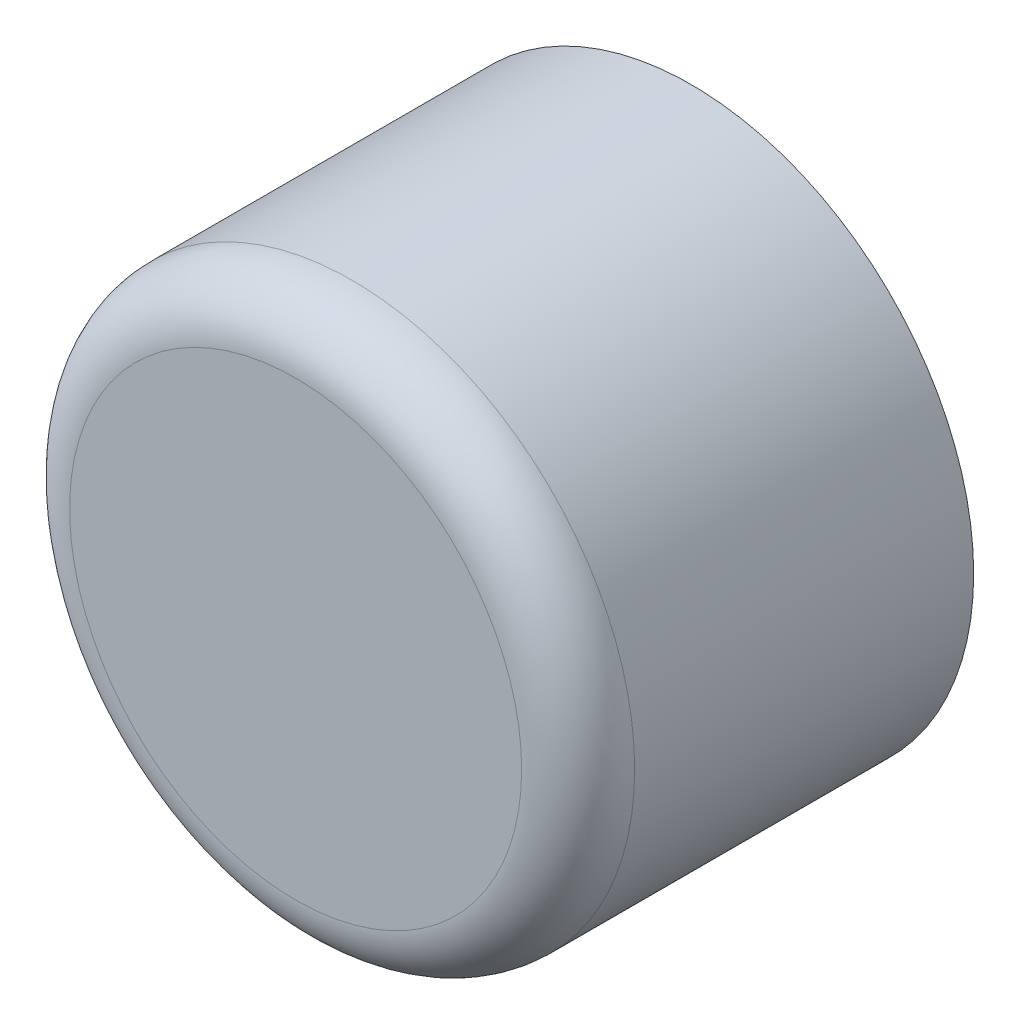
ISO-10303-21;
HEADER;
FILE_DESCRIPTION(('STEP AP214'),'2;1');
FILE_NAME('part.step','',(''),(''),'','','');
FILE_SCHEMA(('AUTOMOTIVE_DESIGN { 1 0 10303 214 1 1 1 1 }'));
ENDSEC;
DATA;
#1=APPLICATION_CONTEXT('core data for automotive mechanical design processes');
#2=APPLICATION_PROTOCOL_DEFINITION('international standard','automotive_design',2000,#1);
#3=PRODUCT_CONTEXT('',#1,'mechanical');
#4=PRODUCT('Part','Part','',(#3));
#5=PRODUCT_RELATED_PRODUCT_CATEGORY('part','',(#4));
#6=PRODUCT_DEFINITION_FORMATION('','',#4);
#7=PRODUCT_DEFINITION_CONTEXT('part definition',#1,'design');
#8=PRODUCT_DEFINITION('design','',#6,#7);
#9=PRODUCT_DEFINITION_SHAPE('','',#8);
#10=(LENGTH_UNIT() NAMED_UNIT(*) SI_UNIT(.MILLI.,.METRE.));
#11=(NAMED_UNIT(*) PLANE_ANGLE_UNIT() SI_UNIT($,.RADIAN.));
#12=(NAMED_UNIT(*) SI_UNIT($,.STERADIAN.) SOLID_ANGLE_UNIT());
#13=UNCERTAINTY_MEASURE_WITH_UNIT(LENGTH_MEASURE(1.E-05),#10,'distance_accuracy_value','');
#14=(GEOMETRIC_REPRESENTATION_CONTEXT(3) GLOBAL_UNCERTAINTY_ASSIGNED_CONTEXT((#13)) GLOBAL_UNIT_ASSIGNED_CONTEXT((#10,
#11,#12)) REPRESENTATION_CONTEXT('',''));
#15=CARTESIAN_POINT('',(0.,0.,0.));
#16=DIRECTION('',(0.,0.,1.));
#17=DIRECTION('',(1.,0.,0.));
#18=AXIS2_PLACEMENT_3D('',#15,#16,#17);
#19=CARTESIAN_POINT('',(30.4183841102695,-58.0983755696771,7.97179999999999));
#20=DIRECTION('',(0.,0.,-1.));
#21=DIRECTION('',(-1.,0.,0.));
#22=AXIS2_PLACEMENT_3D('',#19,#20,#21);
#23=CYLINDRICAL_SURFACE('',#22,5.);
#24=CARTESIAN_POINT('',(30.4183841102695,-58.0983755696771,6.97179999999999));
#25=DIRECTION('',(0.,0.,1.));
#26=DIRECTION('',(1.,0.,0.));
#27=AXIS2_PLACEMENT_3D('',#24,#25,#26);
#28=CIRCLE('',#27,5.);
#29=CARTESIAN_POINT('',(35.4183841102695,-58.0983755696771,6.97179999999999));
#30=VERTEX_POINT('',#29);
#31=EDGE_CURVE('E11',#30,#30,#28,.F.);
#32=ORIENTED_EDGE('',*,*,#31,.T.);
#33=EDGE_LOOP('',(#32));
#34=FACE_BOUND('',#33,.T.);
#35=CARTESIAN_POINT('',(30.4183841102695,-58.0983755696771,0.971799999999992));
#36=DIRECTION('',(0.,0.,-1.));
#37=DIRECTION('',(-1.,0.,0.));
#38=AXIS2_PLACEMENT_3D('',#35,#36,#37);
#39=CIRCLE('',#38,5.);
#40=CARTESIAN_POINT('',(25.4183841102695,-58.0983755696771,0.971799999999992));
#41=VERTEX_POINT('',#40);
#42=EDGE_CURVE('E111',#41,#41,#39,.T.);
#43=ORIENTED_EDGE('',*,*,#42,.F.);
#44=EDGE_LOOP('',(#43));
#45=FACE_BOUND('',#44,.T.);
#46=ADVANCED_FACE('F33',(#34,#45),#23,.T.);
#47=CARTESIAN_POINT('',(30.4183841102695,-58.0983755696771,7.97179999999999));
#48=DIRECTION('',(0.,0.,1.));
#49=DIRECTION('',(1.,0.,0.));
#50=AXIS2_PLACEMENT_3D('',#47,#48,#49);
#51=PLANE('',#50);
#52=CARTESIAN_POINT('',(30.4183841102695,-58.0983755696771,7.97179999999999));
#53=DIRECTION('',(0.,0.,1.));
#54=DIRECTION('',(1.,0.,0.));
#55=AXIS2_PLACEMENT_3D('',#52,#53,#54);
#56=CIRCLE('',#55,4.);
#57=CARTESIAN_POINT('',(34.4183841102695,-58.0983755696771,7.97179999999999));
#58=VERTEX_POINT('',#57);
#59=EDGE_CURVE('E41',#58,#58,#56,.T.);
#60=ORIENTED_EDGE('',*,*,#59,.T.);
#61=EDGE_LOOP('',(#60));
#62=FACE_BOUND('',#61,.T.);
#63=ADVANCED_FACE('F116',(#62),#51,.T.);
#64=CARTESIAN_POINT('',(30.4183841102695,-58.0983755696771,0.971799999999992));
#65=DIRECTION('',(0.,0.,-1.));
#66=DIRECTION('',(-1.,0.,0.));
#67=AXIS2_PLACEMENT_3D('',#64,#65,#66);
#68=PLANE('',#67);
#69=DIRECTION('',(-0.729860722083863,0.683595879419428,0.));
#70=VECTOR('',#69,1.);
#71=CARTESIAN_POINT('',(30.1635455688319,-61.1200389589047,0.971799999999992));
#72=LINE('',#71,#70);
#73=CARTESIAN_POINT('',(30.5284759298738,-61.4618368986144,0.971799999999992));
#74=VERTEX_POINT('',#73);
#75=CARTESIAN_POINT('',(27.0549227813323,-58.2084673892815,0.971799999999992));
#76=VERTEX_POINT('',#75);
#77=EDGE_CURVE('E56',#74,#76,#72,.T.);
#78=ORIENTED_EDGE('',*,*,#77,.F.);
#79=DIRECTION('',(-0.683595879419425,-0.729860722083866,0.));
#80=VECTOR('',#79,1.);
#81=CARTESIAN_POINT('',(33.7818454392067,-57.9882837500729,0.971799999999992));
#82=LINE('',#81,#80);
#83=CARTESIAN_POINT('',(33.7818454392067,-57.9882837500729,0.971799999999992));
#84=VERTEX_POINT('',#83);
#85=EDGE_CURVE('E95',#84,#74,#82,.T.);
#86=ORIENTED_EDGE('',*,*,#85,.F.);
#87=DIRECTION('',(0.729860722083864,-0.683595879419427,0.));
#88=VECTOR('',#87,1.);
#89=CARTESIAN_POINT('',(30.6732226517071,-55.0767121804496,0.971799999999992));
#90=LINE('',#89,#88);
#91=CARTESIAN_POINT('',(30.3082922906652,-54.7349142407399,0.971799999999992));
#92=VERTEX_POINT('',#91);
#93=EDGE_CURVE('E48',#92,#84,#90,.T.);
#94=ORIENTED_EDGE('',*,*,#93,.F.);
#95=DIRECTION('',(0.683595879419427,0.729860722083865,0.));
#96=VECTOR('',#95,1.);
#97=CARTESIAN_POINT('',(27.0549227813323,-58.2084673892815,0.971799999999992));
#98=LINE('',#97,#96);
#99=EDGE_CURVE('E83',#76,#92,#98,.T.);
#100=ORIENTED_EDGE('',*,*,#99,.F.);
#101=EDGE_LOOP('',(#78,#86,#94,#100));
#102=FACE_BOUND('',#101,.T.);
#103=ORIENTED_EDGE('',*,*,#42,.T.);
#104=EDGE_LOOP('',(#103));
#105=FACE_BOUND('',#104,.T.);
#106=ADVANCED_FACE('F132',(#102,#105),#68,.T.);
#107=CARTESIAN_POINT('',(30.4183841102695,-58.0983755696771,2.97179999999999));
#108=DIRECTION('',(0.,0.,1.));
#109=DIRECTION('',(1.,0.,0.));
#110=AXIS2_PLACEMENT_3D('',#107,#108,#109);
#111=PLANE('',#110);
#112=DIRECTION('',(-0.729860722083864,0.683595879419427,0.));
#113=VECTOR('',#112,1.);
#114=CARTESIAN_POINT('',(33.4169150781648,-57.6464858103631,2.97179999999999));
#115=LINE('',#114,#113);
#116=CARTESIAN_POINT('',(33.7818454392067,-57.9882837500729,2.97179999999999));
#117=VERTEX_POINT('',#116);
#118=CARTESIAN_POINT('',(30.3082922906652,-54.7349142407399,2.97179999999999));
#119=VERTEX_POINT('',#118);
#120=EDGE_CURVE('E88',#117,#119,#115,.T.);
#121=ORIENTED_EDGE('',*,*,#120,.F.);
#122=DIRECTION('',(0.683595879419425,0.729860722083866,0.));
#123=VECTOR('',#122,1.);
#124=CARTESIAN_POINT('',(30.5284759298738,-61.4618368986144,2.97179999999999));
#125=LINE('',#124,#123);
#126=CARTESIAN_POINT('',(30.5284759298738,-61.4618368986144,2.97179999999999));
#127=VERTEX_POINT('',#126);
#128=EDGE_CURVE('E86',#127,#117,#125,.T.);
#129=ORIENTED_EDGE('',*,*,#128,.F.);
#130=DIRECTION('',(0.729860722083863,-0.683595879419428,0.));
#131=VECTOR('',#130,1.);
#132=CARTESIAN_POINT('',(27.4198531423742,-58.5502653289912,2.97179999999999));
#133=LINE('',#132,#131);
#134=CARTESIAN_POINT('',(27.0549227813323,-58.2084673892815,2.97179999999999));
#135=VERTEX_POINT('',#134);
#136=EDGE_CURVE('E73',#135,#127,#133,.T.);
#137=ORIENTED_EDGE('',*,*,#136,.F.);
#138=DIRECTION('',(-0.683595879419427,-0.729860722083865,0.));
#139=VECTOR('',#138,1.);
#140=CARTESIAN_POINT('',(30.3082922906652,-54.7349142407399,2.97179999999999));
#141=LINE('',#140,#139);
#142=EDGE_CURVE('E103',#119,#135,#141,.T.);
#143=ORIENTED_EDGE('',*,*,#142,.F.);
#144=EDGE_LOOP('',(#121,#129,#137,#143));
#145=FACE_BOUND('',#144,.T.);
#146=ADVANCED_FACE('F87',(#145),#111,.F.);
#147=CARTESIAN_POINT('',(-13.1457130353455,-14.0353970776317,0.));
#148=DIRECTION('',(-0.683595879419427,-0.729860722083864,0.));
#149=DIRECTION('',(0.729860722083864,-0.683595879419427,0.));
#150=AXIS2_PLACEMENT_3D('',#147,#148,#149);
#151=PLANE('',#150);
#152=ORIENTED_EDGE('',*,*,#93,.T.);
#153=DIRECTION('',(0.,0.,-1.));
#154=VECTOR('',#153,1.);
#155=CARTESIAN_POINT('',(33.7818454392067,-57.9882837500729,2.97179999999999));
#156=LINE('',#155,#154);
#157=EDGE_CURVE('E92',#117,#84,#156,.T.);
#158=ORIENTED_EDGE('',*,*,#157,.F.);
#159=ORIENTED_EDGE('',*,*,#120,.T.);
#160=DIRECTION('',(0.,0.,1.));
#161=VECTOR('',#160,1.);
#162=CARTESIAN_POINT('',(30.3082922906652,-54.7349142407399,0.971799999999992));
#163=LINE('',#162,#161);
#164=EDGE_CURVE('E100',#92,#119,#163,.T.);
#165=ORIENTED_EDGE('',*,*,#164,.F.);
#166=EDGE_LOOP('',(#152,#158,#159,#165));
#167=FACE_BOUND('',#166,.T.);
#168=ADVANCED_FACE('F137',(#167),#151,.T.);
#169=CARTESIAN_POINT('',(-16.3990825446784,-17.5089502261732,0.));
#170=DIRECTION('',(0.683595879419428,0.729860722083863,0.));
#171=DIRECTION('',(-0.729860722083863,0.683595879419428,0.));
#172=AXIS2_PLACEMENT_3D('',#169,#170,#171);
#173=PLANE('',#172);
#174=ORIENTED_EDGE('',*,*,#77,.T.);
#175=DIRECTION('',(0.,0.,-1.));
#176=VECTOR('',#175,1.);
#177=CARTESIAN_POINT('',(27.0549227813323,-58.2084673892815,2.97179999999999));
#178=LINE('',#177,#176);
#179=EDGE_CURVE('E79',#135,#76,#178,.T.);
#180=ORIENTED_EDGE('',*,*,#179,.F.);
#181=ORIENTED_EDGE('',*,*,#136,.T.);
#182=DIRECTION('',(0.,0.,1.));
#183=VECTOR('',#182,1.);
#184=CARTESIAN_POINT('',(30.5284759298738,-61.4618368986144,0.971799999999992));
#185=LINE('',#184,#183);
#186=EDGE_CURVE('E77',#74,#127,#185,.T.);
#187=ORIENTED_EDGE('',*,*,#186,.F.);
#188=EDGE_LOOP('',(#174,#180,#181,#187));
#189=FACE_BOUND('',#188,.T.);
#190=ADVANCED_FACE('F75',(#189),#173,.T.);
#191=CARTESIAN_POINT('',(43.4540053260107,-40.6995171631081,0.));
#192=DIRECTION('',(0.729860722083865,-0.683595879419427,0.));
#193=DIRECTION('',(0.683595879419427,0.729860722083865,0.));
#194=AXIS2_PLACEMENT_3D('',#191,#192,#193);
#195=PLANE('',#194);
#196=ORIENTED_EDGE('',*,*,#164,.T.);
#197=ORIENTED_EDGE('',*,*,#142,.T.);
#198=ORIENTED_EDGE('',*,*,#179,.T.);
#199=ORIENTED_EDGE('',*,*,#99,.T.);
#200=EDGE_LOOP('',(#196,#197,#198,#199));
#201=FACE_BOUND('',#200,.T.);
#202=ADVANCED_FACE('F123',(#201),#195,.T.);
#203=CARTESIAN_POINT('',(46.9275584745523,-43.9528866724409,0.));
#204=DIRECTION('',(-0.729860722083866,0.683595879419425,0.));
#205=DIRECTION('',(-0.683595879419425,-0.729860722083866,0.));
#206=AXIS2_PLACEMENT_3D('',#203,#204,#205);
#207=PLANE('',#206);
#208=ORIENTED_EDGE('',*,*,#186,.T.);
#209=ORIENTED_EDGE('',*,*,#128,.T.);
#210=ORIENTED_EDGE('',*,*,#157,.T.);
#211=ORIENTED_EDGE('',*,*,#85,.T.);
#212=EDGE_LOOP('',(#208,#209,#210,#211));
#213=FACE_BOUND('',#212,.T.);
#214=ADVANCED_FACE('F94',(#213),#207,.T.);
#215=CARTESIAN_POINT('',(30.4183841102695,-58.0983755696771,6.97179999999999));
#216=DIRECTION('',(0.,0.,1.));
#217=DIRECTION('',(1.,0.,0.));
#218=AXIS2_PLACEMENT_3D('',#215,#216,#217);
#219=TOROIDAL_SURFACE('',#218,4.,1.);
#220=ORIENTED_EDGE('',*,*,#31,.F.);
#221=EDGE_LOOP('',(#220));
#222=FACE_BOUND('',#221,.T.);
#223=ORIENTED_EDGE('',*,*,#59,.F.);
#224=EDGE_LOOP('',(#223));
#225=FACE_BOUND('',#224,.T.);
#226=ADVANCED_FACE('F35',(#222,#225),#219,.T.);
#227=CLOSED_SHELL('',(#46,#63,#106,#146,#168,#190,#202,#214,#226));
#228=MANIFOLD_SOLID_BREP('B2',#227);
#229=ADVANCED_BREP_SHAPE_REPRESENTATION('',(#18,#228),#14);
#230=SHAPE_DEFINITION_REPRESENTATION(#9,#229);
ENDSEC;
END-ISO-10303-21;
